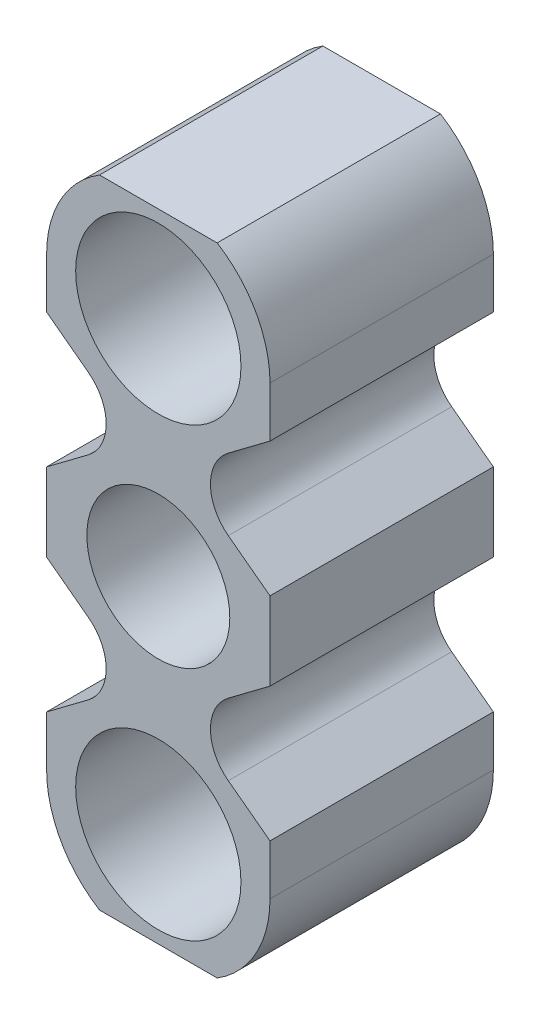
ISO-10303-21;
HEADER;
FILE_DESCRIPTION(('STEP AP214'),'2;1');
FILE_NAME('part.step','',(''),(''),'','','');
FILE_SCHEMA(('AUTOMOTIVE_DESIGN { 1 0 10303 214 1 1 1 1 }'));
ENDSEC;
DATA;
#1=APPLICATION_CONTEXT('core data for automotive mechanical design processes');
#2=APPLICATION_PROTOCOL_DEFINITION('international standard','automotive_design',2000,#1);
#3=PRODUCT_CONTEXT('',#1,'mechanical');
#4=PRODUCT('Part','Part','',(#3));
#5=PRODUCT_RELATED_PRODUCT_CATEGORY('part','',(#4));
#6=PRODUCT_DEFINITION_FORMATION('','',#4);
#7=PRODUCT_DEFINITION_CONTEXT('part definition',#1,'design');
#8=PRODUCT_DEFINITION('design','',#6,#7);
#9=PRODUCT_DEFINITION_SHAPE('','',#8);
#10=(LENGTH_UNIT() NAMED_UNIT(*) SI_UNIT(.MILLI.,.METRE.));
#11=(NAMED_UNIT(*) PLANE_ANGLE_UNIT() SI_UNIT($,.RADIAN.));
#12=(NAMED_UNIT(*) SI_UNIT($,.STERADIAN.) SOLID_ANGLE_UNIT());
#13=UNCERTAINTY_MEASURE_WITH_UNIT(LENGTH_MEASURE(1.E-05),#10,'distance_accuracy_value','');
#14=(GEOMETRIC_REPRESENTATION_CONTEXT(3) GLOBAL_UNCERTAINTY_ASSIGNED_CONTEXT((#13)) GLOBAL_UNIT_ASSIGNED_CONTEXT((#10,
#11,#12)) REPRESENTATION_CONTEXT('',''));
#15=CARTESIAN_POINT('',(0.,0.,0.));
#16=DIRECTION('',(0.,0.,1.));
#17=DIRECTION('',(1.,0.,0.));
#18=AXIS2_PLACEMENT_3D('',#15,#16,#17);
#19=CARTESIAN_POINT('',(0.,10.,10.));
#20=DIRECTION('',(0.,0.,-1.));
#21=DIRECTION('',(-1.,0.,0.));
#22=AXIS2_PLACEMENT_3D('',#19,#20,#21);
#23=CYLINDRICAL_SURFACE('',#22,5.);
#24=CARTESIAN_POINT('',(0.,10.,10.));
#25=DIRECTION('',(0.,0.,1.));
#26=DIRECTION('',(1.,0.,0.));
#27=AXIS2_PLACEMENT_3D('',#24,#25,#26);
#28=CIRCLE('',#27,5.);
#29=CARTESIAN_POINT('',(-2.63391343821319,14.25,10.));
#30=VERTEX_POINT('',#29);
#31=CARTESIAN_POINT('',(-5.,10.,10.));
#32=VERTEX_POINT('',#31);
#33=EDGE_CURVE('E300',#30,#32,#28,.T.);
#34=ORIENTED_EDGE('',*,*,#33,.F.);
#35=DIRECTION('',(0.,0.,-1.));
#36=VECTOR('',#35,1.);
#37=CARTESIAN_POINT('',(-2.63391343821319,14.25,10.));
#38=LINE('',#37,#36);
#39=CARTESIAN_POINT('',(-2.63391343821319,14.25,0.));
#40=VERTEX_POINT('',#39);
#41=EDGE_CURVE('E11',#30,#40,#38,.T.);
#42=ORIENTED_EDGE('',*,*,#41,.T.);
#43=CARTESIAN_POINT('',(0.,10.,0.));
#44=DIRECTION('',(0.,0.,1.));
#45=DIRECTION('',(1.,0.,0.));
#46=AXIS2_PLACEMENT_3D('',#43,#44,#45);
#47=CIRCLE('',#46,5.);
#48=CARTESIAN_POINT('',(-5.,10.,0.));
#49=VERTEX_POINT('',#48);
#50=EDGE_CURVE('E322',#40,#49,#47,.T.);
#51=ORIENTED_EDGE('',*,*,#50,.T.);
#52=DIRECTION('',(0.,0.,-1.));
#53=VECTOR('',#52,1.);
#54=CARTESIAN_POINT('',(-5.,10.,10.));
#55=LINE('',#54,#53);
#56=EDGE_CURVE('E244',#32,#49,#55,.T.);
#57=ORIENTED_EDGE('',*,*,#56,.F.);
#58=EDGE_LOOP('',(#34,#42,#51,#57));
#59=FACE_BOUND('',#58,.T.);
#60=ADVANCED_FACE('F36',(#59),#23,.T.);
#61=CARTESIAN_POINT('',(0.,-10.,10.));
#62=DIRECTION('',(0.,0.,-1.));
#63=DIRECTION('',(-1.,0.,0.));
#64=AXIS2_PLACEMENT_3D('',#61,#62,#63);
#65=CYLINDRICAL_SURFACE('',#64,5.);
#66=CARTESIAN_POINT('',(0.,-10.,10.));
#67=DIRECTION('',(0.,0.,1.));
#68=DIRECTION('',(1.,0.,0.));
#69=AXIS2_PLACEMENT_3D('',#66,#67,#68);
#70=CIRCLE('',#69,5.);
#71=CARTESIAN_POINT('',(2.63391343821319,-14.25,10.));
#72=VERTEX_POINT('',#71);
#73=CARTESIAN_POINT('',(5.,-10.,10.));
#74=VERTEX_POINT('',#73);
#75=EDGE_CURVE('E309',#72,#74,#70,.T.);
#76=ORIENTED_EDGE('',*,*,#75,.F.);
#77=DIRECTION('',(0.,0.,-1.));
#78=VECTOR('',#77,1.);
#79=CARTESIAN_POINT('',(2.63391343821319,-14.25,10.));
#80=LINE('',#79,#78);
#81=CARTESIAN_POINT('',(2.63391343821319,-14.25,0.));
#82=VERTEX_POINT('',#81);
#83=EDGE_CURVE('E203',#72,#82,#80,.T.);
#84=ORIENTED_EDGE('',*,*,#83,.T.);
#85=CARTESIAN_POINT('',(0.,-10.,0.));
#86=DIRECTION('',(0.,0.,1.));
#87=DIRECTION('',(1.,0.,0.));
#88=AXIS2_PLACEMENT_3D('',#85,#86,#87);
#89=CIRCLE('',#88,5.);
#90=CARTESIAN_POINT('',(5.,-10.,0.));
#91=VERTEX_POINT('',#90);
#92=EDGE_CURVE('E214',#82,#91,#89,.T.);
#93=ORIENTED_EDGE('',*,*,#92,.T.);
#94=DIRECTION('',(0.,0.,-1.));
#95=VECTOR('',#94,1.);
#96=CARTESIAN_POINT('',(5.,-10.,10.));
#97=LINE('',#96,#95);
#98=EDGE_CURVE('E239',#74,#91,#97,.T.);
#99=ORIENTED_EDGE('',*,*,#98,.F.);
#100=EDGE_LOOP('',(#76,#84,#93,#99));
#101=FACE_BOUND('',#100,.T.);
#102=ADVANCED_FACE('F400',(#101),#65,.T.);
#103=CARTESIAN_POINT('',(0.,0.,0.));
#104=DIRECTION('',(0.,0.,1.));
#105=DIRECTION('',(1.,0.,0.));
#106=AXIS2_PLACEMENT_3D('',#103,#104,#105);
#107=PLANE('',#106);
#108=CARTESIAN_POINT('',(0.,10.,0.));
#109=DIRECTION('',(0.,0.,1.));
#110=DIRECTION('',(1.,0.,0.));
#111=AXIS2_PLACEMENT_3D('',#108,#109,#110);
#112=CIRCLE('',#111,3.7);
#113=CARTESIAN_POINT('',(3.7,10.,0.));
#114=VERTEX_POINT('',#113);
#115=EDGE_CURVE('E320',#114,#114,#112,.T.);
#116=ORIENTED_EDGE('',*,*,#115,.T.);
#117=EDGE_LOOP('',(#116));
#118=FACE_BOUND('',#117,.T.);
#119=CARTESIAN_POINT('',(0.,0.,0.));
#120=DIRECTION('',(0.,0.,1.));
#121=DIRECTION('',(1.,0.,0.));
#122=AXIS2_PLACEMENT_3D('',#119,#120,#121);
#123=CIRCLE('',#122,3.2);
#124=CARTESIAN_POINT('',(3.2,0.,0.));
#125=VERTEX_POINT('',#124);
#126=EDGE_CURVE('E230',#125,#125,#123,.T.);
#127=ORIENTED_EDGE('',*,*,#126,.T.);
#128=EDGE_LOOP('',(#127));
#129=FACE_BOUND('',#128,.T.);
#130=CARTESIAN_POINT('',(0.,-10.,0.));
#131=DIRECTION('',(0.,0.,1.));
#132=DIRECTION('',(1.,0.,0.));
#133=AXIS2_PLACEMENT_3D('',#130,#131,#132);
#134=CIRCLE('',#133,3.7);
#135=CARTESIAN_POINT('',(3.7,-10.,0.));
#136=VERTEX_POINT('',#135);
#137=EDGE_CURVE('E233',#136,#136,#134,.T.);
#138=ORIENTED_EDGE('',*,*,#137,.T.);
#139=EDGE_LOOP('',(#138));
#140=FACE_BOUND('',#139,.T.);
#141=ORIENTED_EDGE('',*,*,#50,.F.);
#142=DIRECTION('',(-1.,0.,0.));
#143=VECTOR('',#142,1.);
#144=CARTESIAN_POINT('',(8.21939799331104,14.25,0.));
#145=LINE('',#144,#143);
#146=CARTESIAN_POINT('',(2.63391343821319,14.25,0.));
#147=VERTEX_POINT('',#146);
#148=EDGE_CURVE('E457',#147,#40,#145,.T.);
#149=ORIENTED_EDGE('',*,*,#148,.F.);
#150=CARTESIAN_POINT('',(5.,10.,0.));
#151=VERTEX_POINT('',#150);
#152=EDGE_CURVE('E290',#151,#147,#47,.T.);
#153=ORIENTED_EDGE('',*,*,#152,.F.);
#154=DIRECTION('',(0.,-1.,0.));
#155=VECTOR('',#154,1.);
#156=CARTESIAN_POINT('',(5.,0.,0.));
#157=LINE('',#156,#155);
#158=CARTESIAN_POINT('',(5.,7.75,0.));
#159=VERTEX_POINT('',#158);
#160=EDGE_CURVE('E224',#151,#159,#157,.T.);
#161=ORIENTED_EDGE('',*,*,#160,.T.);
#162=DIRECTION('',(-0.8,-0.6,0.));
#163=VECTOR('',#162,1.);
#164=CARTESIAN_POINT('',(5.,7.75,0.));
#165=LINE('',#164,#163);
#166=CARTESIAN_POINT('',(3.13333333333333,6.35,0.));
#167=VERTEX_POINT('',#166);
#168=EDGE_CURVE('E344',#159,#167,#165,.T.);
#169=ORIENTED_EDGE('',*,*,#168,.T.);
#170=CARTESIAN_POINT('',(4.33333333333333,4.75,0.));
#171=DIRECTION('',(0.,0.,1.));
#172=DIRECTION('',(1.,0.,0.));
#173=AXIS2_PLACEMENT_3D('',#170,#171,#172);
#174=CIRCLE('',#173,2.);
#175=CARTESIAN_POINT('',(3.13333333333333,3.15,0.));
#176=VERTEX_POINT('',#175);
#177=EDGE_CURVE('E275',#167,#176,#174,.T.);
#178=ORIENTED_EDGE('',*,*,#177,.T.);
#179=DIRECTION('',(0.8,-0.6,0.));
#180=VECTOR('',#179,1.);
#181=CARTESIAN_POINT('',(1.,4.75,0.));
#182=LINE('',#181,#180);
#183=CARTESIAN_POINT('',(5.,1.75,0.));
#184=VERTEX_POINT('',#183);
#185=EDGE_CURVE('E348',#176,#184,#182,.T.);
#186=ORIENTED_EDGE('',*,*,#185,.T.);
#187=CARTESIAN_POINT('',(5.,-1.75,0.));
#188=VERTEX_POINT('',#187);
#189=EDGE_CURVE('E222',#184,#188,#157,.T.);
#190=ORIENTED_EDGE('',*,*,#189,.T.);
#191=DIRECTION('',(0.8,0.6,0.));
#192=VECTOR('',#191,1.);
#193=CARTESIAN_POINT('',(1.,-4.75,0.));
#194=LINE('',#193,#192);
#195=CARTESIAN_POINT('',(3.13333333333333,-3.15,0.));
#196=VERTEX_POINT('',#195);
#197=EDGE_CURVE('E407',#196,#188,#194,.T.);
#198=ORIENTED_EDGE('',*,*,#197,.F.);
#199=CARTESIAN_POINT('',(4.33333333333333,-4.75,0.));
#200=DIRECTION('',(0.,0.,1.));
#201=DIRECTION('',(1.,0.,0.));
#202=AXIS2_PLACEMENT_3D('',#199,#200,#201);
#203=CIRCLE('',#202,2.);
#204=CARTESIAN_POINT('',(3.13333333333333,-6.35,0.));
#205=VERTEX_POINT('',#204);
#206=EDGE_CURVE('E271',#196,#205,#203,.T.);
#207=ORIENTED_EDGE('',*,*,#206,.T.);
#208=DIRECTION('',(-0.8,0.6,0.));
#209=VECTOR('',#208,1.);
#210=CARTESIAN_POINT('',(5.,-7.75,0.));
#211=LINE('',#210,#209);
#212=CARTESIAN_POINT('',(5.,-7.75,0.));
#213=VERTEX_POINT('',#212);
#214=EDGE_CURVE('E403',#213,#205,#211,.T.);
#215=ORIENTED_EDGE('',*,*,#214,.F.);
#216=EDGE_CURVE('E220',#213,#91,#157,.T.);
#217=ORIENTED_EDGE('',*,*,#216,.T.);
#218=ORIENTED_EDGE('',*,*,#92,.F.);
#219=DIRECTION('',(1.,0.,0.));
#220=VECTOR('',#219,1.);
#221=CARTESIAN_POINT('',(10.5193139835714,-14.25,0.));
#222=LINE('',#221,#220);
#223=CARTESIAN_POINT('',(-2.63391343821319,-14.25,0.));
#224=VERTEX_POINT('',#223);
#225=EDGE_CURVE('E197',#224,#82,#222,.T.);
#226=ORIENTED_EDGE('',*,*,#225,.F.);
#227=CARTESIAN_POINT('',(-5.,-10.,0.));
#228=VERTEX_POINT('',#227);
#229=EDGE_CURVE('E212',#228,#224,#89,.T.);
#230=ORIENTED_EDGE('',*,*,#229,.F.);
#231=DIRECTION('',(0.,-1.,0.));
#232=VECTOR('',#231,1.);
#233=CARTESIAN_POINT('',(-5.,0.,0.));
#234=LINE('',#233,#232);
#235=CARTESIAN_POINT('',(-5.,-7.75,0.));
#236=VERTEX_POINT('',#235);
#237=EDGE_CURVE('E324',#236,#228,#234,.T.);
#238=ORIENTED_EDGE('',*,*,#237,.F.);
#239=DIRECTION('',(0.8,0.6,0.));
#240=VECTOR('',#239,1.);
#241=CARTESIAN_POINT('',(-5.,-7.75,0.));
#242=LINE('',#241,#240);
#243=CARTESIAN_POINT('',(-3.13333333333333,-6.35,0.));
#244=VERTEX_POINT('',#243);
#245=EDGE_CURVE('E419',#236,#244,#242,.T.);
#246=ORIENTED_EDGE('',*,*,#245,.T.);
#247=CARTESIAN_POINT('',(-4.33333333333333,-4.75,0.));
#248=DIRECTION('',(0.,0.,1.));
#249=DIRECTION('',(1.,0.,0.));
#250=AXIS2_PLACEMENT_3D('',#247,#248,#249);
#251=CIRCLE('',#250,2.);
#252=CARTESIAN_POINT('',(-3.13333333333333,-3.15,0.));
#253=VERTEX_POINT('',#252);
#254=EDGE_CURVE('E267',#244,#253,#251,.T.);
#255=ORIENTED_EDGE('',*,*,#254,.T.);
#256=DIRECTION('',(-0.8,0.6,0.));
#257=VECTOR('',#256,1.);
#258=CARTESIAN_POINT('',(-1.,-4.75,0.));
#259=LINE('',#258,#257);
#260=CARTESIAN_POINT('',(-5.,-1.75,0.));
#261=VERTEX_POINT('',#260);
#262=EDGE_CURVE('E422',#253,#261,#259,.T.);
#263=ORIENTED_EDGE('',*,*,#262,.T.);
#264=CARTESIAN_POINT('',(-5.,1.75,0.));
#265=VERTEX_POINT('',#264);
#266=EDGE_CURVE('E325',#265,#261,#234,.T.);
#267=ORIENTED_EDGE('',*,*,#266,.F.);
#268=DIRECTION('',(-0.8,-0.6,0.));
#269=VECTOR('',#268,1.);
#270=CARTESIAN_POINT('',(-1.,4.75,0.));
#271=LINE('',#270,#269);
#272=CARTESIAN_POINT('',(-3.13333333333333,3.15,0.));
#273=VERTEX_POINT('',#272);
#274=EDGE_CURVE('E357',#273,#265,#271,.T.);
#275=ORIENTED_EDGE('',*,*,#274,.F.);
#276=CARTESIAN_POINT('',(-4.33333333333333,4.75,0.));
#277=DIRECTION('',(0.,0.,1.));
#278=DIRECTION('',(1.,0.,0.));
#279=AXIS2_PLACEMENT_3D('',#276,#277,#278);
#280=CIRCLE('',#279,2.);
#281=CARTESIAN_POINT('',(-3.13333333333333,6.35,0.));
#282=VERTEX_POINT('',#281);
#283=EDGE_CURVE('E279',#273,#282,#280,.T.);
#284=ORIENTED_EDGE('',*,*,#283,.T.);
#285=DIRECTION('',(0.8,-0.6,0.));
#286=VECTOR('',#285,1.);
#287=CARTESIAN_POINT('',(-5.,7.75,0.));
#288=LINE('',#287,#286);
#289=CARTESIAN_POINT('',(-5.,7.75,0.));
#290=VERTEX_POINT('',#289);
#291=EDGE_CURVE('E331',#290,#282,#288,.T.);
#292=ORIENTED_EDGE('',*,*,#291,.F.);
#293=EDGE_CURVE('E225',#49,#290,#234,.T.);
#294=ORIENTED_EDGE('',*,*,#293,.F.);
#295=EDGE_LOOP('',(#141,#149,#153,#161,#169,#178,#186,#190,#198,#207,#215,#217,#218,#226,#230,
#238,#246,#255,#263,#267,#275,#284,#292,#294));
#296=FACE_BOUND('',#295,.T.);
#297=ADVANCED_FACE('F210',(#118,#129,#140,#296),#107,.F.);
#298=CARTESIAN_POINT('',(5.,0.,10.));
#299=DIRECTION('',(1.,0.,0.));
#300=DIRECTION('',(0.,0.,-1.));
#301=AXIS2_PLACEMENT_3D('',#298,#299,#300);
#302=PLANE('',#301);
#303=DIRECTION('',(0.,0.,-1.));
#304=VECTOR('',#303,1.);
#305=CARTESIAN_POINT('',(5.,-1.75,51.4578098794425));
#306=LINE('',#305,#304);
#307=CARTESIAN_POINT('',(5.,-1.75,10.));
#308=VERTEX_POINT('',#307);
#309=EDGE_CURVE('E411',#308,#188,#306,.T.);
#310=ORIENTED_EDGE('',*,*,#309,.T.);
#311=ORIENTED_EDGE('',*,*,#189,.F.);
#312=DIRECTION('',(0.,0.,-1.));
#313=VECTOR('',#312,1.);
#314=CARTESIAN_POINT('',(5.,1.75,63.9578098794425));
#315=LINE('',#314,#313);
#316=CARTESIAN_POINT('',(5.,1.75,10.));
#317=VERTEX_POINT('',#316);
#318=EDGE_CURVE('E370',#317,#184,#315,.T.);
#319=ORIENTED_EDGE('',*,*,#318,.F.);
#320=DIRECTION('',(0.,-1.,0.));
#321=VECTOR('',#320,1.);
#322=CARTESIAN_POINT('',(5.,0.,10.));
#323=LINE('',#322,#321);
#324=EDGE_CURVE('E315',#317,#308,#323,.T.);
#325=ORIENTED_EDGE('',*,*,#324,.T.);
#326=EDGE_LOOP('',(#310,#311,#319,#325));
#327=FACE_BOUND('',#326,.T.);
#328=ADVANCED_FACE('F384',(#327),#302,.T.);
#329=CARTESIAN_POINT('',(-5.,0.,10.));
#330=DIRECTION('',(1.,0.,0.));
#331=DIRECTION('',(0.,0.,-1.));
#332=AXIS2_PLACEMENT_3D('',#329,#330,#331);
#333=PLANE('',#332);
#334=DIRECTION('',(0.,0.,-1.));
#335=VECTOR('',#334,1.);
#336=CARTESIAN_POINT('',(-5.,-1.75,51.4578098794425));
#337=LINE('',#336,#335);
#338=CARTESIAN_POINT('',(-5.,-1.75,10.));
#339=VERTEX_POINT('',#338);
#340=EDGE_CURVE('E426',#339,#261,#337,.T.);
#341=ORIENTED_EDGE('',*,*,#340,.F.);
#342=DIRECTION('',(0.,-1.,0.));
#343=VECTOR('',#342,1.);
#344=CARTESIAN_POINT('',(-5.,0.,10.));
#345=LINE('',#344,#343);
#346=CARTESIAN_POINT('',(-5.,1.75,10.));
#347=VERTEX_POINT('',#346);
#348=EDGE_CURVE('E302',#347,#339,#345,.T.);
#349=ORIENTED_EDGE('',*,*,#348,.F.);
#350=DIRECTION('',(0.,0.,-1.));
#351=VECTOR('',#350,1.);
#352=CARTESIAN_POINT('',(-5.,1.75,63.9578098794425));
#353=LINE('',#352,#351);
#354=EDGE_CURVE('E350',#347,#265,#353,.T.);
#355=ORIENTED_EDGE('',*,*,#354,.T.);
#356=ORIENTED_EDGE('',*,*,#266,.T.);
#357=EDGE_LOOP('',(#341,#349,#355,#356));
#358=FACE_BOUND('',#357,.T.);
#359=ADVANCED_FACE('F439',(#358),#333,.F.);
#360=DIRECTION('',(0.,0.,-1.));
#361=VECTOR('',#360,1.);
#362=CARTESIAN_POINT('',(-5.,-7.75,51.4578098794425));
#363=LINE('',#362,#361);
#364=CARTESIAN_POINT('',(-5.,-7.75,10.));
#365=VERTEX_POINT('',#364);
#366=EDGE_CURVE('E424',#365,#236,#363,.T.);
#367=ORIENTED_EDGE('',*,*,#366,.T.);
#368=ORIENTED_EDGE('',*,*,#237,.T.);
#369=DIRECTION('',(0.,0.,-1.));
#370=VECTOR('',#369,1.);
#371=CARTESIAN_POINT('',(-5.,-10.,10.));
#372=LINE('',#371,#370);
#373=CARTESIAN_POINT('',(-5.,-10.,10.));
#374=VERTEX_POINT('',#373);
#375=EDGE_CURVE('E219',#374,#228,#372,.T.);
#376=ORIENTED_EDGE('',*,*,#375,.F.);
#377=EDGE_CURVE('E299',#365,#374,#345,.T.);
#378=ORIENTED_EDGE('',*,*,#377,.F.);
#379=EDGE_LOOP('',(#367,#368,#376,#378));
#380=FACE_BOUND('',#379,.T.);
#381=ADVANCED_FACE('F456',(#380),#333,.F.);
#382=CARTESIAN_POINT('',(0.,0.,10.));
#383=DIRECTION('',(0.,0.,1.));
#384=DIRECTION('',(1.,0.,0.));
#385=AXIS2_PLACEMENT_3D('',#382,#383,#384);
#386=PLANE('',#385);
#387=DIRECTION('',(-1.,0.,0.));
#388=VECTOR('',#387,1.);
#389=CARTESIAN_POINT('',(8.21939799331104,14.25,10.));
#390=LINE('',#389,#388);
#391=CARTESIAN_POINT('',(2.63391343821319,14.25,10.));
#392=VERTEX_POINT('',#391);
#393=EDGE_CURVE('E51',#392,#30,#390,.T.);
#394=ORIENTED_EDGE('',*,*,#393,.T.);
#395=ORIENTED_EDGE('',*,*,#33,.T.);
#396=CARTESIAN_POINT('',(-5.,7.75,10.));
#397=VERTEX_POINT('',#396);
#398=EDGE_CURVE('E304',#32,#397,#345,.T.);
#399=ORIENTED_EDGE('',*,*,#398,.T.);
#400=DIRECTION('',(0.8,-0.6,0.));
#401=VECTOR('',#400,1.);
#402=CARTESIAN_POINT('',(-5.,7.75,10.));
#403=LINE('',#402,#401);
#404=CARTESIAN_POINT('',(-3.13333333333333,6.35,10.));
#405=VERTEX_POINT('',#404);
#406=EDGE_CURVE('E339',#397,#405,#403,.T.);
#407=ORIENTED_EDGE('',*,*,#406,.T.);
#408=CARTESIAN_POINT('',(-4.33333333333333,4.75,10.));
#409=DIRECTION('',(0.,0.,1.));
#410=DIRECTION('',(1.,0.,0.));
#411=AXIS2_PLACEMENT_3D('',#408,#409,#410);
#412=CIRCLE('',#411,2.);
#413=CARTESIAN_POINT('',(-3.13333333333333,3.15,10.));
#414=VERTEX_POINT('',#413);
#415=EDGE_CURVE('E204',#405,#414,#412,.F.);
#416=ORIENTED_EDGE('',*,*,#415,.T.);
#417=DIRECTION('',(-0.8,-0.6,0.));
#418=VECTOR('',#417,1.);
#419=CARTESIAN_POINT('',(-1.,4.75,10.));
#420=LINE('',#419,#418);
#421=EDGE_CURVE('E345',#414,#347,#420,.T.);
#422=ORIENTED_EDGE('',*,*,#421,.T.);
#423=ORIENTED_EDGE('',*,*,#348,.T.);
#424=DIRECTION('',(-0.8,0.6,0.));
#425=VECTOR('',#424,1.);
#426=CARTESIAN_POINT('',(-1.,-4.75,10.));
#427=LINE('',#426,#425);
#428=CARTESIAN_POINT('',(-3.13333333333333,-3.15,10.));
#429=VERTEX_POINT('',#428);
#430=EDGE_CURVE('E354',#429,#339,#427,.T.);
#431=ORIENTED_EDGE('',*,*,#430,.F.);
#432=CARTESIAN_POINT('',(-4.33333333333333,-4.75,10.));
#433=DIRECTION('',(0.,0.,1.));
#434=DIRECTION('',(1.,0.,0.));
#435=AXIS2_PLACEMENT_3D('',#432,#433,#434);
#436=CIRCLE('',#435,2.);
#437=CARTESIAN_POINT('',(-3.13333333333333,-6.35,10.));
#438=VERTEX_POINT('',#437);
#439=EDGE_CURVE('E269',#429,#438,#436,.F.);
#440=ORIENTED_EDGE('',*,*,#439,.T.);
#441=DIRECTION('',(0.8,0.6,0.));
#442=VECTOR('',#441,1.);
#443=CARTESIAN_POINT('',(-5.,-7.75,10.));
#444=LINE('',#443,#442);
#445=EDGE_CURVE('E358',#365,#438,#444,.T.);
#446=ORIENTED_EDGE('',*,*,#445,.F.);
#447=ORIENTED_EDGE('',*,*,#377,.T.);
#448=CARTESIAN_POINT('',(-2.63391343821319,-14.25,10.));
#449=VERTEX_POINT('',#448);
#450=EDGE_CURVE('E310',#374,#449,#70,.T.);
#451=ORIENTED_EDGE('',*,*,#450,.T.);
#452=DIRECTION('',(1.,0.,0.));
#453=VECTOR('',#452,1.);
#454=CARTESIAN_POINT('',(10.5193139835714,-14.25,10.));
#455=LINE('',#454,#453);
#456=EDGE_CURVE('E59',#449,#72,#455,.T.);
#457=ORIENTED_EDGE('',*,*,#456,.T.);
#458=ORIENTED_EDGE('',*,*,#75,.T.);
#459=CARTESIAN_POINT('',(5.,-7.75,10.));
#460=VERTEX_POINT('',#459);
#461=EDGE_CURVE('E312',#460,#74,#323,.T.);
#462=ORIENTED_EDGE('',*,*,#461,.F.);
#463=DIRECTION('',(-0.8,0.6,0.));
#464=VECTOR('',#463,1.);
#465=CARTESIAN_POINT('',(5.,-7.75,10.));
#466=LINE('',#465,#464);
#467=CARTESIAN_POINT('',(3.13333333333333,-6.35,10.));
#468=VERTEX_POINT('',#467);
#469=EDGE_CURVE('E410',#460,#468,#466,.T.);
#470=ORIENTED_EDGE('',*,*,#469,.T.);
#471=CARTESIAN_POINT('',(4.33333333333333,-4.75,10.));
#472=DIRECTION('',(0.,0.,1.));
#473=DIRECTION('',(1.,0.,0.));
#474=AXIS2_PLACEMENT_3D('',#471,#472,#473);
#475=CIRCLE('',#474,2.);
#476=CARTESIAN_POINT('',(3.13333333333333,-3.15,10.));
#477=VERTEX_POINT('',#476);
#478=EDGE_CURVE('E273',#468,#477,#475,.F.);
#479=ORIENTED_EDGE('',*,*,#478,.T.);
#480=DIRECTION('',(0.8,0.6,0.));
#481=VECTOR('',#480,1.);
#482=CARTESIAN_POINT('',(1.,-4.75,10.));
#483=LINE('',#482,#481);
#484=EDGE_CURVE('E388',#477,#308,#483,.T.);
#485=ORIENTED_EDGE('',*,*,#484,.T.);
#486=ORIENTED_EDGE('',*,*,#324,.F.);
#487=DIRECTION('',(0.8,-0.6,0.));
#488=VECTOR('',#487,1.);
#489=CARTESIAN_POINT('',(1.,4.75,10.));
#490=LINE('',#489,#488);
#491=CARTESIAN_POINT('',(3.13333333333333,3.15,10.));
#492=VERTEX_POINT('',#491);
#493=EDGE_CURVE('E364',#492,#317,#490,.T.);
#494=ORIENTED_EDGE('',*,*,#493,.F.);
#495=CARTESIAN_POINT('',(4.33333333333333,4.75,10.));
#496=DIRECTION('',(0.,0.,1.));
#497=DIRECTION('',(1.,0.,0.));
#498=AXIS2_PLACEMENT_3D('',#495,#496,#497);
#499=CIRCLE('',#498,2.);
#500=CARTESIAN_POINT('',(3.13333333333333,6.35,10.));
#501=VERTEX_POINT('',#500);
#502=EDGE_CURVE('E277',#492,#501,#499,.F.);
#503=ORIENTED_EDGE('',*,*,#502,.T.);
#504=DIRECTION('',(-0.8,-0.6,0.));
#505=VECTOR('',#504,1.);
#506=CARTESIAN_POINT('',(5.,7.75,10.));
#507=LINE('',#506,#505);
#508=CARTESIAN_POINT('',(5.,7.75,10.));
#509=VERTEX_POINT('',#508);
#510=EDGE_CURVE('E323',#509,#501,#507,.T.);
#511=ORIENTED_EDGE('',*,*,#510,.F.);
#512=CARTESIAN_POINT('',(5.,10.,10.));
#513=VERTEX_POINT('',#512);
#514=EDGE_CURVE('E298',#513,#509,#323,.T.);
#515=ORIENTED_EDGE('',*,*,#514,.F.);
#516=EDGE_CURVE('E287',#513,#392,#28,.T.);
#517=ORIENTED_EDGE('',*,*,#516,.T.);
#518=EDGE_LOOP('',(#394,#395,#399,#407,#416,#422,#423,#431,#440,#446,#447,#451,#457,#458,#462,
#470,#479,#485,#486,#494,#503,#511,#515,#517));
#519=FACE_BOUND('',#518,.T.);
#520=CARTESIAN_POINT('',(0.,10.,10.));
#521=DIRECTION('',(0.,0.,1.));
#522=DIRECTION('',(1.,0.,0.));
#523=AXIS2_PLACEMENT_3D('',#520,#521,#522);
#524=CIRCLE('',#523,3.7);
#525=CARTESIAN_POINT('',(3.7,10.,10.));
#526=VERTEX_POINT('',#525);
#527=EDGE_CURVE('E236',#526,#526,#524,.T.);
#528=ORIENTED_EDGE('',*,*,#527,.F.);
#529=EDGE_LOOP('',(#528));
#530=FACE_BOUND('',#529,.T.);
#531=CARTESIAN_POINT('',(0.,0.,10.));
#532=DIRECTION('',(0.,0.,1.));
#533=DIRECTION('',(1.,0.,0.));
#534=AXIS2_PLACEMENT_3D('',#531,#532,#533);
#535=CIRCLE('',#534,3.2);
#536=CARTESIAN_POINT('',(3.2,0.,10.));
#537=VERTEX_POINT('',#536);
#538=EDGE_CURVE('E314',#537,#537,#535,.T.);
#539=ORIENTED_EDGE('',*,*,#538,.F.);
#540=EDGE_LOOP('',(#539));
#541=FACE_BOUND('',#540,.T.);
#542=CARTESIAN_POINT('',(0.,-10.,10.));
#543=DIRECTION('',(0.,0.,1.));
#544=DIRECTION('',(1.,0.,0.));
#545=AXIS2_PLACEMENT_3D('',#542,#543,#544);
#546=CIRCLE('',#545,3.7);
#547=CARTESIAN_POINT('',(3.7,-10.,10.));
#548=VERTEX_POINT('',#547);
#549=EDGE_CURVE('E240',#548,#548,#546,.T.);
#550=ORIENTED_EDGE('',*,*,#549,.F.);
#551=EDGE_LOOP('',(#550));
#552=FACE_BOUND('',#551,.T.);
#553=ADVANCED_FACE('F293',(#519,#530,#541,#552),#386,.T.);
#554=DIRECTION('',(0.,0.,-1.));
#555=VECTOR('',#554,1.);
#556=CARTESIAN_POINT('',(5.,-7.75,51.4578098794425));
#557=LINE('',#556,#555);
#558=EDGE_CURVE('E395',#460,#213,#557,.T.);
#559=ORIENTED_EDGE('',*,*,#558,.F.);
#560=ORIENTED_EDGE('',*,*,#461,.T.);
#561=ORIENTED_EDGE('',*,*,#98,.T.);
#562=ORIENTED_EDGE('',*,*,#216,.F.);
#563=EDGE_LOOP('',(#559,#560,#561,#562));
#564=FACE_BOUND('',#563,.T.);
#565=ADVANCED_FACE('F393',(#564),#302,.T.);
#566=ORIENTED_EDGE('',*,*,#514,.T.);
#567=DIRECTION('',(0.,0.,-1.));
#568=VECTOR('',#567,1.);
#569=CARTESIAN_POINT('',(5.,7.75,63.9578098794425));
#570=LINE('',#569,#568);
#571=EDGE_CURVE('E367',#509,#159,#570,.T.);
#572=ORIENTED_EDGE('',*,*,#571,.T.);
#573=ORIENTED_EDGE('',*,*,#160,.F.);
#574=DIRECTION('',(0.,0.,-1.));
#575=VECTOR('',#574,1.);
#576=CARTESIAN_POINT('',(5.,10.,10.));
#577=LINE('',#576,#575);
#578=EDGE_CURVE('E237',#513,#151,#577,.T.);
#579=ORIENTED_EDGE('',*,*,#578,.F.);
#580=EDGE_LOOP('',(#566,#572,#573,#579));
#581=FACE_BOUND('',#580,.T.);
#582=ADVANCED_FACE('F475',(#581),#302,.T.);
#583=ORIENTED_EDGE('',*,*,#152,.T.);
#584=DIRECTION('',(0.,0.,-1.));
#585=VECTOR('',#584,1.);
#586=CARTESIAN_POINT('',(2.63391343821319,14.25,10.));
#587=LINE('',#586,#585);
#588=EDGE_CURVE('E44',#147,#392,#587,.F.);
#589=ORIENTED_EDGE('',*,*,#588,.T.);
#590=ORIENTED_EDGE('',*,*,#516,.F.);
#591=ORIENTED_EDGE('',*,*,#578,.T.);
#592=EDGE_LOOP('',(#583,#589,#590,#591));
#593=FACE_BOUND('',#592,.T.);
#594=ADVANCED_FACE('F286',(#593),#23,.T.);
#595=ORIENTED_EDGE('',*,*,#293,.T.);
#596=DIRECTION('',(0.,0.,-1.));
#597=VECTOR('',#596,1.);
#598=CARTESIAN_POINT('',(-5.,7.75,63.9578098794425));
#599=LINE('',#598,#597);
#600=EDGE_CURVE('E336',#397,#290,#599,.T.);
#601=ORIENTED_EDGE('',*,*,#600,.F.);
#602=ORIENTED_EDGE('',*,*,#398,.F.);
#603=ORIENTED_EDGE('',*,*,#56,.T.);
#604=EDGE_LOOP('',(#595,#601,#602,#603));
#605=FACE_BOUND('',#604,.T.);
#606=ADVANCED_FACE('F335',(#605),#333,.F.);
#607=ORIENTED_EDGE('',*,*,#229,.T.);
#608=DIRECTION('',(0.,0.,-1.));
#609=VECTOR('',#608,1.);
#610=CARTESIAN_POINT('',(-2.63391343821319,-14.25,10.));
#611=LINE('',#610,#609);
#612=EDGE_CURVE('E194',#224,#449,#611,.F.);
#613=ORIENTED_EDGE('',*,*,#612,.T.);
#614=ORIENTED_EDGE('',*,*,#450,.F.);
#615=ORIENTED_EDGE('',*,*,#375,.T.);
#616=EDGE_LOOP('',(#607,#613,#614,#615));
#617=FACE_BOUND('',#616,.T.);
#618=ADVANCED_FACE('F217',(#617),#65,.T.);
#619=CARTESIAN_POINT('',(0.,0.,10.));
#620=DIRECTION('',(0.,0.,-1.));
#621=DIRECTION('',(-1.,0.,0.));
#622=AXIS2_PLACEMENT_3D('',#619,#620,#621);
#623=CYLINDRICAL_SURFACE('',#622,3.2);
#624=ORIENTED_EDGE('',*,*,#538,.T.);
#625=EDGE_LOOP('',(#624));
#626=FACE_BOUND('',#625,.T.);
#627=ORIENTED_EDGE('',*,*,#126,.F.);
#628=EDGE_LOOP('',(#627));
#629=FACE_BOUND('',#628,.T.);
#630=ADVANCED_FACE('F518',(#626,#629),#623,.F.);
#631=CARTESIAN_POINT('',(0.,10.,10.));
#632=DIRECTION('',(0.,0.,-1.));
#633=DIRECTION('',(-1.,0.,0.));
#634=AXIS2_PLACEMENT_3D('',#631,#632,#633);
#635=CYLINDRICAL_SURFACE('',#634,3.7);
#636=ORIENTED_EDGE('',*,*,#527,.T.);
#637=EDGE_LOOP('',(#636));
#638=FACE_BOUND('',#637,.T.);
#639=ORIENTED_EDGE('',*,*,#115,.F.);
#640=EDGE_LOOP('',(#639));
#641=FACE_BOUND('',#640,.T.);
#642=ADVANCED_FACE('F516',(#638,#641),#635,.F.);
#643=CARTESIAN_POINT('',(0.,-10.,10.));
#644=DIRECTION('',(0.,0.,-1.));
#645=DIRECTION('',(-1.,0.,0.));
#646=AXIS2_PLACEMENT_3D('',#643,#644,#645);
#647=CYLINDRICAL_SURFACE('',#646,3.7);
#648=ORIENTED_EDGE('',*,*,#549,.T.);
#649=EDGE_LOOP('',(#648));
#650=FACE_BOUND('',#649,.T.);
#651=ORIENTED_EDGE('',*,*,#137,.F.);
#652=EDGE_LOOP('',(#651));
#653=FACE_BOUND('',#652,.T.);
#654=ADVANCED_FACE('F514',(#650,#653),#647,.F.);
#655=CARTESIAN_POINT('',(1.,4.75,63.9578098794425));
#656=DIRECTION('',(0.6,0.8,0.));
#657=DIRECTION('',(-0.8,0.6,0.));
#658=AXIS2_PLACEMENT_3D('',#655,#656,#657);
#659=PLANE('',#658);
#660=ORIENTED_EDGE('',*,*,#185,.F.);
#661=DIRECTION('',(0.,0.,-1.));
#662=VECTOR('',#661,1.);
#663=CARTESIAN_POINT('',(3.13333333333333,3.15,10.));
#664=LINE('',#663,#662);
#665=EDGE_CURVE('E260',#176,#492,#664,.F.);
#666=ORIENTED_EDGE('',*,*,#665,.T.);
#667=ORIENTED_EDGE('',*,*,#493,.T.);
#668=ORIENTED_EDGE('',*,*,#318,.T.);
#669=EDGE_LOOP('',(#660,#666,#667,#668));
#670=FACE_BOUND('',#669,.T.);
#671=ADVANCED_FACE('F376',(#670),#659,.T.);
#672=CARTESIAN_POINT('',(5.,7.75,63.9578098794425));
#673=DIRECTION('',(0.6,-0.8,0.));
#674=DIRECTION('',(0.8,0.6,0.));
#675=AXIS2_PLACEMENT_3D('',#672,#673,#674);
#676=PLANE('',#675);
#677=ORIENTED_EDGE('',*,*,#510,.T.);
#678=DIRECTION('',(0.,0.,-1.));
#679=VECTOR('',#678,1.);
#680=CARTESIAN_POINT('',(3.13333333333333,6.35,0.));
#681=LINE('',#680,#679);
#682=EDGE_CURVE('E257',#501,#167,#681,.T.);
#683=ORIENTED_EDGE('',*,*,#682,.T.);
#684=ORIENTED_EDGE('',*,*,#168,.F.);
#685=ORIENTED_EDGE('',*,*,#571,.F.);
#686=EDGE_LOOP('',(#677,#683,#684,#685));
#687=FACE_BOUND('',#686,.T.);
#688=ADVANCED_FACE('F472',(#687),#676,.T.);
#689=CARTESIAN_POINT('',(-1.,4.75,63.9578098794425));
#690=DIRECTION('',(0.6,-0.8,0.));
#691=DIRECTION('',(0.8,0.6,0.));
#692=AXIS2_PLACEMENT_3D('',#689,#690,#691);
#693=PLANE('',#692);
#694=ORIENTED_EDGE('',*,*,#421,.F.);
#695=DIRECTION('',(0.,0.,-1.));
#696=VECTOR('',#695,1.);
#697=CARTESIAN_POINT('',(-3.13333333333333,3.15,0.));
#698=LINE('',#697,#696);
#699=EDGE_CURVE('E262',#414,#273,#698,.T.);
#700=ORIENTED_EDGE('',*,*,#699,.T.);
#701=ORIENTED_EDGE('',*,*,#274,.T.);
#702=ORIENTED_EDGE('',*,*,#354,.F.);
#703=EDGE_LOOP('',(#694,#700,#701,#702));
#704=FACE_BOUND('',#703,.T.);
#705=ADVANCED_FACE('F445',(#704),#693,.F.);
#706=CARTESIAN_POINT('',(-5.,7.75,63.9578098794425));
#707=DIRECTION('',(0.6,0.8,0.));
#708=DIRECTION('',(-0.8,0.6,0.));
#709=AXIS2_PLACEMENT_3D('',#706,#707,#708);
#710=PLANE('',#709);
#711=ORIENTED_EDGE('',*,*,#291,.T.);
#712=DIRECTION('',(0.,0.,-1.));
#713=VECTOR('',#712,1.);
#714=CARTESIAN_POINT('',(-3.13333333333333,6.35,10.));
#715=LINE('',#714,#713);
#716=EDGE_CURVE('E265',#282,#405,#715,.F.);
#717=ORIENTED_EDGE('',*,*,#716,.T.);
#718=ORIENTED_EDGE('',*,*,#406,.F.);
#719=ORIENTED_EDGE('',*,*,#600,.T.);
#720=EDGE_LOOP('',(#711,#717,#718,#719));
#721=FACE_BOUND('',#720,.T.);
#722=ADVANCED_FACE('F342',(#721),#710,.F.);
#723=CARTESIAN_POINT('',(-1.,-4.75,51.4578098794425));
#724=DIRECTION('',(-0.6,-0.8,0.));
#725=DIRECTION('',(0.8,-0.6,0.));
#726=AXIS2_PLACEMENT_3D('',#723,#724,#725);
#727=PLANE('',#726);
#728=ORIENTED_EDGE('',*,*,#262,.F.);
#729=DIRECTION('',(0.,0.,-1.));
#730=VECTOR('',#729,1.);
#731=CARTESIAN_POINT('',(-3.13333333333333,-3.15,10.));
#732=LINE('',#731,#730);
#733=EDGE_CURVE('E250',#253,#429,#732,.F.);
#734=ORIENTED_EDGE('',*,*,#733,.T.);
#735=ORIENTED_EDGE('',*,*,#430,.T.);
#736=ORIENTED_EDGE('',*,*,#340,.T.);
#737=EDGE_LOOP('',(#728,#734,#735,#736));
#738=FACE_BOUND('',#737,.T.);
#739=ADVANCED_FACE('F433',(#738),#727,.T.);
#740=CARTESIAN_POINT('',(-5.,-7.75,51.4578098794425));
#741=DIRECTION('',(-0.6,0.8,0.));
#742=DIRECTION('',(-0.8,-0.6,0.));
#743=AXIS2_PLACEMENT_3D('',#740,#741,#742);
#744=PLANE('',#743);
#745=ORIENTED_EDGE('',*,*,#445,.T.);
#746=DIRECTION('',(0.,0.,-1.));
#747=VECTOR('',#746,1.);
#748=CARTESIAN_POINT('',(-3.13333333333334,-6.35,0.));
#749=LINE('',#748,#747);
#750=EDGE_CURVE('E247',#438,#244,#749,.T.);
#751=ORIENTED_EDGE('',*,*,#750,.T.);
#752=ORIENTED_EDGE('',*,*,#245,.F.);
#753=ORIENTED_EDGE('',*,*,#366,.F.);
#754=EDGE_LOOP('',(#745,#751,#752,#753));
#755=FACE_BOUND('',#754,.T.);
#756=ADVANCED_FACE('F454',(#755),#744,.T.);
#757=CARTESIAN_POINT('',(1.,-4.75,51.4578098794425));
#758=DIRECTION('',(-0.6,0.8,0.));
#759=DIRECTION('',(-0.8,-0.6,0.));
#760=AXIS2_PLACEMENT_3D('',#757,#758,#759);
#761=PLANE('',#760);
#762=ORIENTED_EDGE('',*,*,#484,.F.);
#763=DIRECTION('',(0.,0.,-1.));
#764=VECTOR('',#763,1.);
#765=CARTESIAN_POINT('',(3.13333333333333,-3.15,0.));
#766=LINE('',#765,#764);
#767=EDGE_CURVE('E252',#477,#196,#766,.T.);
#768=ORIENTED_EDGE('',*,*,#767,.T.);
#769=ORIENTED_EDGE('',*,*,#197,.T.);
#770=ORIENTED_EDGE('',*,*,#309,.F.);
#771=EDGE_LOOP('',(#762,#768,#769,#770));
#772=FACE_BOUND('',#771,.T.);
#773=ADVANCED_FACE('F467',(#772),#761,.F.);
#774=CARTESIAN_POINT('',(5.,-7.75,51.4578098794425));
#775=DIRECTION('',(-0.6,-0.8,0.));
#776=DIRECTION('',(0.8,-0.6,0.));
#777=AXIS2_PLACEMENT_3D('',#774,#775,#776);
#778=PLANE('',#777);
#779=ORIENTED_EDGE('',*,*,#214,.T.);
#780=DIRECTION('',(0.,0.,-1.));
#781=VECTOR('',#780,1.);
#782=CARTESIAN_POINT('',(3.13333333333334,-6.35,10.));
#783=LINE('',#782,#781);
#784=EDGE_CURVE('E255',#205,#468,#783,.F.);
#785=ORIENTED_EDGE('',*,*,#784,.T.);
#786=ORIENTED_EDGE('',*,*,#469,.F.);
#787=ORIENTED_EDGE('',*,*,#558,.T.);
#788=EDGE_LOOP('',(#779,#785,#786,#787));
#789=FACE_BOUND('',#788,.T.);
#790=ADVANCED_FACE('F409',(#789),#778,.F.);
#791=CARTESIAN_POINT('',(-4.33333333333333,-4.75,51.4578098794425));
#792=DIRECTION('',(0.,0.,1.));
#793=DIRECTION('',(1.,0.,0.));
#794=AXIS2_PLACEMENT_3D('',#791,#792,#793);
#795=CYLINDRICAL_SURFACE('',#794,2.);
#796=ORIENTED_EDGE('',*,*,#439,.F.);
#797=ORIENTED_EDGE('',*,*,#733,.F.);
#798=ORIENTED_EDGE('',*,*,#254,.F.);
#799=ORIENTED_EDGE('',*,*,#750,.F.);
#800=EDGE_LOOP('',(#796,#797,#798,#799));
#801=FACE_BOUND('',#800,.T.);
#802=ADVANCED_FACE('F449',(#801),#795,.F.);
#803=CARTESIAN_POINT('',(4.33333333333333,-4.75,51.4578098794425));
#804=DIRECTION('',(0.,0.,1.));
#805=DIRECTION('',(1.,0.,0.));
#806=AXIS2_PLACEMENT_3D('',#803,#804,#805);
#807=CYLINDRICAL_SURFACE('',#806,2.);
#808=ORIENTED_EDGE('',*,*,#478,.F.);
#809=ORIENTED_EDGE('',*,*,#784,.F.);
#810=ORIENTED_EDGE('',*,*,#206,.F.);
#811=ORIENTED_EDGE('',*,*,#767,.F.);
#812=EDGE_LOOP('',(#808,#809,#810,#811));
#813=FACE_BOUND('',#812,.T.);
#814=ADVANCED_FACE('F465',(#813),#807,.F.);
#815=CARTESIAN_POINT('',(4.33333333333333,4.75,63.9578098794425));
#816=DIRECTION('',(0.,0.,1.));
#817=DIRECTION('',(1.,0.,0.));
#818=AXIS2_PLACEMENT_3D('',#815,#816,#817);
#819=CYLINDRICAL_SURFACE('',#818,2.);
#820=ORIENTED_EDGE('',*,*,#502,.F.);
#821=ORIENTED_EDGE('',*,*,#665,.F.);
#822=ORIENTED_EDGE('',*,*,#177,.F.);
#823=ORIENTED_EDGE('',*,*,#682,.F.);
#824=EDGE_LOOP('',(#820,#821,#822,#823));
#825=FACE_BOUND('',#824,.T.);
#826=ADVANCED_FACE('F469',(#825),#819,.F.);
#827=CARTESIAN_POINT('',(-4.33333333333333,4.75,63.9578098794425));
#828=DIRECTION('',(0.,0.,1.));
#829=DIRECTION('',(1.,0.,0.));
#830=AXIS2_PLACEMENT_3D('',#827,#828,#829);
#831=CYLINDRICAL_SURFACE('',#830,2.);
#832=ORIENTED_EDGE('',*,*,#415,.F.);
#833=ORIENTED_EDGE('',*,*,#716,.F.);
#834=ORIENTED_EDGE('',*,*,#283,.F.);
#835=ORIENTED_EDGE('',*,*,#699,.F.);
#836=EDGE_LOOP('',(#832,#833,#834,#835));
#837=FACE_BOUND('',#836,.T.);
#838=ADVANCED_FACE('F38',(#837),#831,.F.);
#839=CARTESIAN_POINT('',(10.5193139835714,-14.25,10.));
#840=DIRECTION('',(0.,1.,0.));
#841=DIRECTION('',(0.,0.,1.));
#842=AXIS2_PLACEMENT_3D('',#839,#840,#841);
#843=PLANE('',#842);
#844=ORIENTED_EDGE('',*,*,#456,.F.);
#845=ORIENTED_EDGE('',*,*,#612,.F.);
#846=ORIENTED_EDGE('',*,*,#225,.T.);
#847=ORIENTED_EDGE('',*,*,#83,.F.);
#848=EDGE_LOOP('',(#844,#845,#846,#847));
#849=FACE_BOUND('',#848,.T.);
#850=ADVANCED_FACE('F196',(#849),#843,.F.);
#851=CARTESIAN_POINT('',(8.21939799331104,14.25,10.));
#852=DIRECTION('',(0.,-1.,0.));
#853=DIRECTION('',(0.,0.,-1.));
#854=AXIS2_PLACEMENT_3D('',#851,#852,#853);
#855=PLANE('',#854);
#856=ORIENTED_EDGE('',*,*,#393,.F.);
#857=ORIENTED_EDGE('',*,*,#588,.F.);
#858=ORIENTED_EDGE('',*,*,#148,.T.);
#859=ORIENTED_EDGE('',*,*,#41,.F.);
#860=EDGE_LOOP('',(#856,#857,#858,#859));
#861=FACE_BOUND('',#860,.T.);
#862=ADVANCED_FACE('F476',(#861),#855,.F.);
#863=CLOSED_SHELL('',(#60,#102,#297,#328,#359,#381,#553,#565,#582,#594,#606,#618,#630,#642,#654,
#671,#688,#705,#722,#739,#756,#773,#790,#802,#814,#826,#838,#850,#862));
#864=MANIFOLD_SOLID_BREP('B2',#863);
#865=ADVANCED_BREP_SHAPE_REPRESENTATION('',(#18,#864),#14);
#866=SHAPE_DEFINITION_REPRESENTATION(#9,#865);
ENDSEC;
END-ISO-10303-21;
